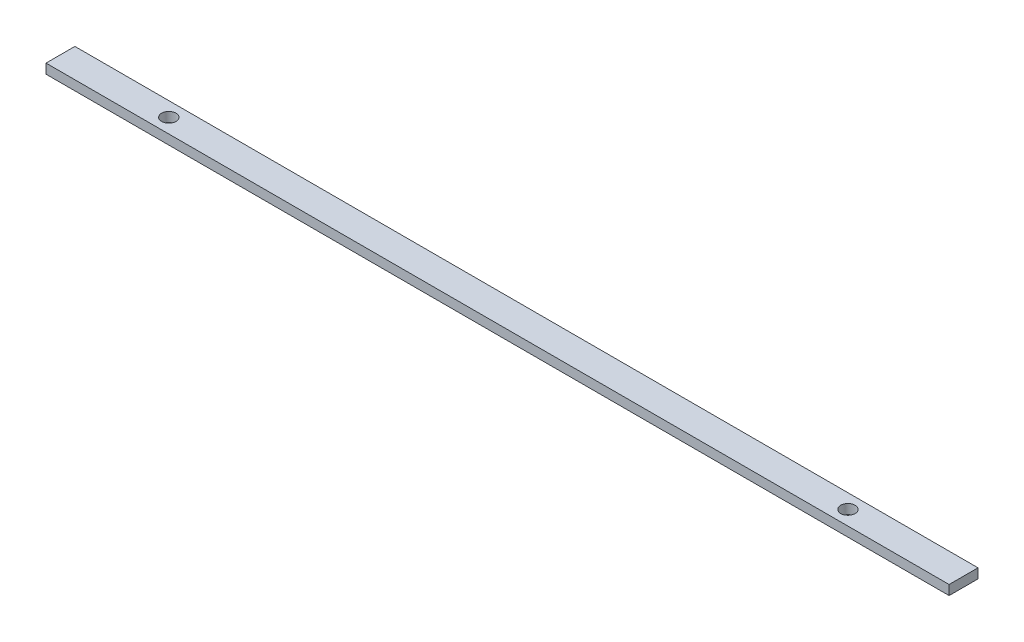
ISO-10303-21;
HEADER;
FILE_DESCRIPTION(('STEP AP214'),'2;1');
FILE_NAME('part.step','',(''),(''),'','','');
FILE_SCHEMA(('AUTOMOTIVE_DESIGN { 1 0 10303 214 1 1 1 1 }'));
ENDSEC;
DATA;
#1=APPLICATION_CONTEXT('core data for automotive mechanical design processes');
#2=APPLICATION_PROTOCOL_DEFINITION('international standard','automotive_design',2000,#1);
#3=PRODUCT_CONTEXT('',#1,'mechanical');
#4=PRODUCT('Part','Part','',(#3));
#5=PRODUCT_RELATED_PRODUCT_CATEGORY('part','',(#4));
#6=PRODUCT_DEFINITION_FORMATION('','',#4);
#7=PRODUCT_DEFINITION_CONTEXT('part definition',#1,'design');
#8=PRODUCT_DEFINITION('design','',#6,#7);
#9=PRODUCT_DEFINITION_SHAPE('','',#8);
#10=(LENGTH_UNIT() NAMED_UNIT(*) SI_UNIT(.MILLI.,.METRE.));
#11=(NAMED_UNIT(*) PLANE_ANGLE_UNIT() SI_UNIT($,.RADIAN.));
#12=(NAMED_UNIT(*) SI_UNIT($,.STERADIAN.) SOLID_ANGLE_UNIT());
#13=UNCERTAINTY_MEASURE_WITH_UNIT(LENGTH_MEASURE(1.E-05),#10,'distance_accuracy_value','');
#14=(GEOMETRIC_REPRESENTATION_CONTEXT(3) GLOBAL_UNCERTAINTY_ASSIGNED_CONTEXT((#13)) GLOBAL_UNIT_ASSIGNED_CONTEXT((#10,
#11,#12)) REPRESENTATION_CONTEXT('',''));
#15=CARTESIAN_POINT('',(0.,0.,0.));
#16=DIRECTION('',(0.,0.,1.));
#17=DIRECTION('',(1.,0.,0.));
#18=AXIS2_PLACEMENT_3D('',#15,#16,#17);
#19=CARTESIAN_POINT('',(0.,4.,0.));
#20=DIRECTION('',(1.,0.,0.));
#21=DIRECTION('',(0.,0.,-1.));
#22=AXIS2_PLACEMENT_3D('',#19,#20,#21);
#23=PLANE('',#22);
#24=DIRECTION('',(0.,0.,1.));
#25=VECTOR('',#24,1.);
#26=CARTESIAN_POINT('',(0.,0.,0.));
#27=LINE('',#26,#25);
#28=CARTESIAN_POINT('',(0.,0.,-12.));
#29=VERTEX_POINT('',#28);
#30=CARTESIAN_POINT('',(0.,0.,0.));
#31=VERTEX_POINT('',#30);
#32=EDGE_CURVE('E96',#29,#31,#27,.T.);
#33=ORIENTED_EDGE('',*,*,#32,.T.);
#34=DIRECTION('',(0.,-1.,0.));
#35=VECTOR('',#34,1.);
#36=CARTESIAN_POINT('',(0.,4.,0.));
#37=LINE('',#36,#35);
#38=CARTESIAN_POINT('',(0.,4.,0.));
#39=VERTEX_POINT('',#38);
#40=EDGE_CURVE('E11',#39,#31,#37,.T.);
#41=ORIENTED_EDGE('',*,*,#40,.F.);
#42=DIRECTION('',(0.,0.,1.));
#43=VECTOR('',#42,1.);
#44=CARTESIAN_POINT('',(0.,4.,0.));
#45=LINE('',#44,#43);
#46=CARTESIAN_POINT('',(0.,4.,-12.));
#47=VERTEX_POINT('',#46);
#48=EDGE_CURVE('E84',#47,#39,#45,.T.);
#49=ORIENTED_EDGE('',*,*,#48,.F.);
#50=DIRECTION('',(0.,-1.,0.));
#51=VECTOR('',#50,1.);
#52=CARTESIAN_POINT('',(0.,4.,-12.));
#53=LINE('',#52,#51);
#54=EDGE_CURVE('E92',#47,#29,#53,.T.);
#55=ORIENTED_EDGE('',*,*,#54,.T.);
#56=EDGE_LOOP('',(#33,#41,#49,#55));
#57=FACE_BOUND('',#56,.T.);
#58=ADVANCED_FACE('F33',(#57),#23,.F.);
#59=CARTESIAN_POINT('',(0.,4.,0.));
#60=DIRECTION('',(0.,0.,-1.));
#61=DIRECTION('',(-1.,0.,0.));
#62=AXIS2_PLACEMENT_3D('',#59,#60,#61);
#63=PLANE('',#62);
#64=DIRECTION('',(1.,0.,0.));
#65=VECTOR('',#64,1.);
#66=CARTESIAN_POINT('',(0.,0.,0.));
#67=LINE('',#66,#65);
#68=CARTESIAN_POINT('',(375.,0.,0.));
#69=VERTEX_POINT('',#68);
#70=EDGE_CURVE('E88',#31,#69,#67,.T.);
#71=ORIENTED_EDGE('',*,*,#70,.T.);
#72=DIRECTION('',(0.,-1.,0.));
#73=VECTOR('',#72,1.);
#74=CARTESIAN_POINT('',(375.,4.,0.));
#75=LINE('',#74,#73);
#76=CARTESIAN_POINT('',(375.,4.,0.));
#77=VERTEX_POINT('',#76);
#78=EDGE_CURVE('E41',#77,#69,#75,.T.);
#79=ORIENTED_EDGE('',*,*,#78,.F.);
#80=DIRECTION('',(1.,0.,0.));
#81=VECTOR('',#80,1.);
#82=CARTESIAN_POINT('',(0.,4.,0.));
#83=LINE('',#82,#81);
#84=EDGE_CURVE('E79',#39,#77,#83,.T.);
#85=ORIENTED_EDGE('',*,*,#84,.F.);
#86=ORIENTED_EDGE('',*,*,#40,.T.);
#87=EDGE_LOOP('',(#71,#79,#85,#86));
#88=FACE_BOUND('',#87,.T.);
#89=ADVANCED_FACE('F87',(#88),#63,.F.);
#90=CARTESIAN_POINT('',(375.,4.,0.));
#91=DIRECTION('',(-1.,0.,0.));
#92=DIRECTION('',(0.,0.,1.));
#93=AXIS2_PLACEMENT_3D('',#90,#91,#92);
#94=PLANE('',#93);
#95=DIRECTION('',(0.,0.,-1.));
#96=VECTOR('',#95,1.);
#97=CARTESIAN_POINT('',(375.,0.,0.));
#98=LINE('',#97,#96);
#99=CARTESIAN_POINT('',(375.,0.,-12.));
#100=VERTEX_POINT('',#99);
#101=EDGE_CURVE('E66',#69,#100,#98,.T.);
#102=ORIENTED_EDGE('',*,*,#101,.T.);
#103=DIRECTION('',(0.,-1.,0.));
#104=VECTOR('',#103,1.);
#105=CARTESIAN_POINT('',(375.,4.,-12.));
#106=LINE('',#105,#104);
#107=CARTESIAN_POINT('',(375.,4.,-12.));
#108=VERTEX_POINT('',#107);
#109=EDGE_CURVE('E89',#108,#100,#106,.T.);
#110=ORIENTED_EDGE('',*,*,#109,.F.);
#111=DIRECTION('',(0.,0.,-1.));
#112=VECTOR('',#111,1.);
#113=CARTESIAN_POINT('',(375.,4.,0.));
#114=LINE('',#113,#112);
#115=EDGE_CURVE('E82',#77,#108,#114,.T.);
#116=ORIENTED_EDGE('',*,*,#115,.F.);
#117=ORIENTED_EDGE('',*,*,#78,.T.);
#118=EDGE_LOOP('',(#102,#110,#116,#117));
#119=FACE_BOUND('',#118,.T.);
#120=ADVANCED_FACE('F90',(#119),#94,.F.);
#121=CARTESIAN_POINT('',(0.,4.,-12.));
#122=DIRECTION('',(0.,0.,1.));
#123=DIRECTION('',(1.,0.,0.));
#124=AXIS2_PLACEMENT_3D('',#121,#122,#123);
#125=PLANE('',#124);
#126=DIRECTION('',(-1.,0.,0.));
#127=VECTOR('',#126,1.);
#128=CARTESIAN_POINT('',(0.,0.,-12.));
#129=LINE('',#128,#127);
#130=EDGE_CURVE('E72',#100,#29,#129,.T.);
#131=ORIENTED_EDGE('',*,*,#130,.T.);
#132=ORIENTED_EDGE('',*,*,#54,.F.);
#133=DIRECTION('',(-1.,0.,0.));
#134=VECTOR('',#133,1.);
#135=CARTESIAN_POINT('',(0.,4.,-12.));
#136=LINE('',#135,#134);
#137=EDGE_CURVE('E49',#108,#47,#136,.T.);
#138=ORIENTED_EDGE('',*,*,#137,.F.);
#139=ORIENTED_EDGE('',*,*,#109,.T.);
#140=EDGE_LOOP('',(#131,#132,#138,#139));
#141=FACE_BOUND('',#140,.T.);
#142=ADVANCED_FACE('F104',(#141),#125,.F.);
#143=CARTESIAN_POINT('',(0.,4.,0.));
#144=DIRECTION('',(0.,-1.,0.));
#145=DIRECTION('',(0.,0.,-1.));
#146=AXIS2_PLACEMENT_3D('',#143,#144,#145);
#147=PLANE('',#146);
#148=CARTESIAN_POINT('',(327.,4.,-6.));
#149=DIRECTION('',(0.,1.,0.));
#150=DIRECTION('',(0.,0.,1.));
#151=AXIS2_PLACEMENT_3D('',#148,#149,#150);
#152=CIRCLE('',#151,2.99999999999999);
#153=CARTESIAN_POINT('',(327.,4.,-3.));
#154=VERTEX_POINT('',#153);
#155=EDGE_CURVE('E116',#154,#154,#152,.T.);
#156=ORIENTED_EDGE('',*,*,#155,.F.);
#157=EDGE_LOOP('',(#156));
#158=FACE_BOUND('',#157,.T.);
#159=CARTESIAN_POINT('',(45.,4.,-6.));
#160=DIRECTION('',(0.,1.,0.));
#161=DIRECTION('',(0.,0.,1.));
#162=AXIS2_PLACEMENT_3D('',#159,#160,#161);
#163=CIRCLE('',#162,3.);
#164=CARTESIAN_POINT('',(45.,4.,-3.));
#165=VERTEX_POINT('',#164);
#166=EDGE_CURVE('E110',#165,#165,#163,.T.);
#167=ORIENTED_EDGE('',*,*,#166,.F.);
#168=EDGE_LOOP('',(#167));
#169=FACE_BOUND('',#168,.T.);
#170=ORIENTED_EDGE('',*,*,#48,.T.);
#171=ORIENTED_EDGE('',*,*,#84,.T.);
#172=ORIENTED_EDGE('',*,*,#115,.T.);
#173=ORIENTED_EDGE('',*,*,#137,.T.);
#174=EDGE_LOOP('',(#170,#171,#172,#173));
#175=FACE_BOUND('',#174,.T.);
#176=ADVANCED_FACE('F80',(#158,#169,#175),#147,.F.);
#177=CARTESIAN_POINT('',(0.,0.,0.));
#178=DIRECTION('',(0.,-1.,0.));
#179=DIRECTION('',(0.,0.,-1.));
#180=AXIS2_PLACEMENT_3D('',#177,#178,#179);
#181=PLANE('',#180);
#182=CARTESIAN_POINT('',(327.,0.,-6.));
#183=DIRECTION('',(0.,1.,0.));
#184=DIRECTION('',(0.,0.,1.));
#185=AXIS2_PLACEMENT_3D('',#182,#183,#184);
#186=CIRCLE('',#185,2.99999999999999);
#187=CARTESIAN_POINT('',(327.,0.,-3.));
#188=VERTEX_POINT('',#187);
#189=EDGE_CURVE('E113',#188,#188,#186,.T.);
#190=ORIENTED_EDGE('',*,*,#189,.T.);
#191=EDGE_LOOP('',(#190));
#192=FACE_BOUND('',#191,.T.);
#193=CARTESIAN_POINT('',(45.,0.,-6.));
#194=DIRECTION('',(0.,1.,0.));
#195=DIRECTION('',(0.,0.,1.));
#196=AXIS2_PLACEMENT_3D('',#193,#194,#195);
#197=CIRCLE('',#196,3.);
#198=CARTESIAN_POINT('',(45.,0.,-3.));
#199=VERTEX_POINT('',#198);
#200=EDGE_CURVE('E99',#199,#199,#197,.T.);
#201=ORIENTED_EDGE('',*,*,#200,.T.);
#202=EDGE_LOOP('',(#201));
#203=FACE_BOUND('',#202,.T.);
#204=ORIENTED_EDGE('',*,*,#32,.F.);
#205=ORIENTED_EDGE('',*,*,#130,.F.);
#206=ORIENTED_EDGE('',*,*,#101,.F.);
#207=ORIENTED_EDGE('',*,*,#70,.F.);
#208=EDGE_LOOP('',(#204,#205,#206,#207));
#209=FACE_BOUND('',#208,.T.);
#210=ADVANCED_FACE('F107',(#192,#203,#209),#181,.T.);
#211=CARTESIAN_POINT('',(45.,0.,-6.));
#212=DIRECTION('',(0.,1.,0.));
#213=DIRECTION('',(0.,0.,1.));
#214=AXIS2_PLACEMENT_3D('',#211,#212,#213);
#215=CYLINDRICAL_SURFACE('',#214,3.);
#216=ORIENTED_EDGE('',*,*,#200,.F.);
#217=EDGE_LOOP('',(#216));
#218=FACE_BOUND('',#217,.T.);
#219=ORIENTED_EDGE('',*,*,#166,.T.);
#220=EDGE_LOOP('',(#219));
#221=FACE_BOUND('',#220,.T.);
#222=ADVANCED_FACE('F127',(#218,#221),#215,.F.);
#223=CARTESIAN_POINT('',(327.,0.,-6.));
#224=DIRECTION('',(0.,1.,0.));
#225=DIRECTION('',(0.,0.,1.));
#226=AXIS2_PLACEMENT_3D('',#223,#224,#225);
#227=CYLINDRICAL_SURFACE('',#226,2.99999999999999);
#228=ORIENTED_EDGE('',*,*,#189,.F.);
#229=EDGE_LOOP('',(#228));
#230=FACE_BOUND('',#229,.T.);
#231=ORIENTED_EDGE('',*,*,#155,.T.);
#232=EDGE_LOOP('',(#231));
#233=FACE_BOUND('',#232,.T.);
#234=ADVANCED_FACE('F124',(#230,#233),#227,.F.);
#235=CLOSED_SHELL('',(#58,#89,#120,#142,#176,#210,#222,#234));
#236=MANIFOLD_SOLID_BREP('B2',#235);
#237=ADVANCED_BREP_SHAPE_REPRESENTATION('',(#18,#236),#14);
#238=SHAPE_DEFINITION_REPRESENTATION(#9,#237);
ENDSEC;
END-ISO-10303-21;
